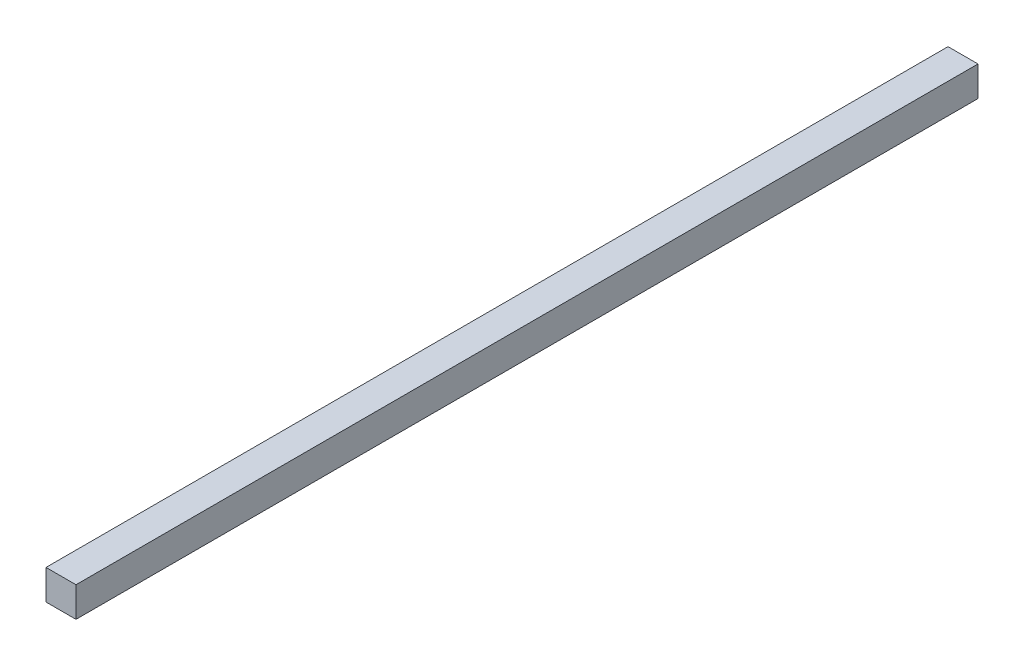
ISO-10303-21;
HEADER;
FILE_DESCRIPTION(('STEP AP214'),'2;1');
FILE_NAME('part.step','',(''),(''),'','','');
FILE_SCHEMA(('AUTOMOTIVE_DESIGN { 1 0 10303 214 1 1 1 1 }'));
ENDSEC;
DATA;
#1=APPLICATION_CONTEXT('core data for automotive mechanical design processes');
#2=APPLICATION_PROTOCOL_DEFINITION('international standard','automotive_design',2000,#1);
#3=PRODUCT_CONTEXT('',#1,'mechanical');
#4=PRODUCT('Part','Part','',(#3));
#5=PRODUCT_RELATED_PRODUCT_CATEGORY('part','',(#4));
#6=PRODUCT_DEFINITION_FORMATION('','',#4);
#7=PRODUCT_DEFINITION_CONTEXT('part definition',#1,'design');
#8=PRODUCT_DEFINITION('design','',#6,#7);
#9=PRODUCT_DEFINITION_SHAPE('','',#8);
#10=(LENGTH_UNIT() NAMED_UNIT(*) SI_UNIT(.MILLI.,.METRE.));
#11=(NAMED_UNIT(*) PLANE_ANGLE_UNIT() SI_UNIT($,.RADIAN.));
#12=(NAMED_UNIT(*) SI_UNIT($,.STERADIAN.) SOLID_ANGLE_UNIT());
#13=UNCERTAINTY_MEASURE_WITH_UNIT(LENGTH_MEASURE(1.E-05),#10,'distance_accuracy_value','');
#14=(GEOMETRIC_REPRESENTATION_CONTEXT(3) GLOBAL_UNCERTAINTY_ASSIGNED_CONTEXT((#13)) GLOBAL_UNIT_ASSIGNED_CONTEXT((#10,
#11,#12)) REPRESENTATION_CONTEXT('',''));
#15=CARTESIAN_POINT('',(0.,0.,0.));
#16=DIRECTION('',(0.,0.,1.));
#17=DIRECTION('',(1.,0.,0.));
#18=AXIS2_PLACEMENT_3D('',#15,#16,#17);
#19=CARTESIAN_POINT('',(0.,0.,300.81));
#20=DIRECTION('',(1.,0.,0.));
#21=DIRECTION('',(0.,0.,-1.));
#22=AXIS2_PLACEMENT_3D('',#19,#20,#21);
#23=PLANE('',#22);
#24=DIRECTION('',(0.,-1.,0.));
#25=VECTOR('',#24,1.);
#26=CARTESIAN_POINT('',(0.,0.,0.));
#27=LINE('',#26,#25);
#28=CARTESIAN_POINT('',(0.,10.,0.));
#29=VERTEX_POINT('',#28);
#30=CARTESIAN_POINT('',(0.,0.,0.));
#31=VERTEX_POINT('',#30);
#32=EDGE_CURVE('E96',#29,#31,#27,.T.);
#33=ORIENTED_EDGE('',*,*,#32,.T.);
#34=DIRECTION('',(0.,0.,-1.));
#35=VECTOR('',#34,1.);
#36=CARTESIAN_POINT('',(0.,0.,300.81));
#37=LINE('',#36,#35);
#38=CARTESIAN_POINT('',(0.,0.,300.81));
#39=VERTEX_POINT('',#38);
#40=EDGE_CURVE('E11',#39,#31,#37,.T.);
#41=ORIENTED_EDGE('',*,*,#40,.F.);
#42=DIRECTION('',(0.,-1.,0.));
#43=VECTOR('',#42,1.);
#44=CARTESIAN_POINT('',(0.,0.,300.81));
#45=LINE('',#44,#43);
#46=CARTESIAN_POINT('',(0.,10.,300.81));
#47=VERTEX_POINT('',#46);
#48=EDGE_CURVE('E84',#47,#39,#45,.T.);
#49=ORIENTED_EDGE('',*,*,#48,.F.);
#50=DIRECTION('',(0.,0.,-1.));
#51=VECTOR('',#50,1.);
#52=CARTESIAN_POINT('',(0.,10.,300.81));
#53=LINE('',#52,#51);
#54=EDGE_CURVE('E92',#47,#29,#53,.T.);
#55=ORIENTED_EDGE('',*,*,#54,.T.);
#56=EDGE_LOOP('',(#33,#41,#49,#55));
#57=FACE_BOUND('',#56,.T.);
#58=ADVANCED_FACE('F33',(#57),#23,.F.);
#59=CARTESIAN_POINT('',(0.,0.,300.81));
#60=DIRECTION('',(0.,1.,0.));
#61=DIRECTION('',(0.,0.,1.));
#62=AXIS2_PLACEMENT_3D('',#59,#60,#61);
#63=PLANE('',#62);
#64=DIRECTION('',(1.,0.,0.));
#65=VECTOR('',#64,1.);
#66=CARTESIAN_POINT('',(0.,0.,0.));
#67=LINE('',#66,#65);
#68=CARTESIAN_POINT('',(10.,0.,0.));
#69=VERTEX_POINT('',#68);
#70=EDGE_CURVE('E88',#31,#69,#67,.T.);
#71=ORIENTED_EDGE('',*,*,#70,.T.);
#72=DIRECTION('',(0.,0.,-1.));
#73=VECTOR('',#72,1.);
#74=CARTESIAN_POINT('',(10.,0.,300.81));
#75=LINE('',#74,#73);
#76=CARTESIAN_POINT('',(10.,0.,300.81));
#77=VERTEX_POINT('',#76);
#78=EDGE_CURVE('E41',#77,#69,#75,.T.);
#79=ORIENTED_EDGE('',*,*,#78,.F.);
#80=DIRECTION('',(1.,0.,0.));
#81=VECTOR('',#80,1.);
#82=CARTESIAN_POINT('',(0.,0.,300.81));
#83=LINE('',#82,#81);
#84=EDGE_CURVE('E79',#39,#77,#83,.T.);
#85=ORIENTED_EDGE('',*,*,#84,.F.);
#86=ORIENTED_EDGE('',*,*,#40,.T.);
#87=EDGE_LOOP('',(#71,#79,#85,#86));
#88=FACE_BOUND('',#87,.T.);
#89=ADVANCED_FACE('F87',(#88),#63,.F.);
#90=CARTESIAN_POINT('',(10.,0.,300.81));
#91=DIRECTION('',(-1.,0.,0.));
#92=DIRECTION('',(0.,0.,1.));
#93=AXIS2_PLACEMENT_3D('',#90,#91,#92);
#94=PLANE('',#93);
#95=DIRECTION('',(0.,1.,0.));
#96=VECTOR('',#95,1.);
#97=CARTESIAN_POINT('',(10.,0.,0.));
#98=LINE('',#97,#96);
#99=CARTESIAN_POINT('',(10.,10.,0.));
#100=VERTEX_POINT('',#99);
#101=EDGE_CURVE('E66',#69,#100,#98,.T.);
#102=ORIENTED_EDGE('',*,*,#101,.T.);
#103=DIRECTION('',(0.,0.,-1.));
#104=VECTOR('',#103,1.);
#105=CARTESIAN_POINT('',(10.,10.,300.81));
#106=LINE('',#105,#104);
#107=CARTESIAN_POINT('',(10.,10.,300.81));
#108=VERTEX_POINT('',#107);
#109=EDGE_CURVE('E89',#108,#100,#106,.T.);
#110=ORIENTED_EDGE('',*,*,#109,.F.);
#111=DIRECTION('',(0.,1.,0.));
#112=VECTOR('',#111,1.);
#113=CARTESIAN_POINT('',(10.,0.,300.81));
#114=LINE('',#113,#112);
#115=EDGE_CURVE('E82',#77,#108,#114,.T.);
#116=ORIENTED_EDGE('',*,*,#115,.F.);
#117=ORIENTED_EDGE('',*,*,#78,.T.);
#118=EDGE_LOOP('',(#102,#110,#116,#117));
#119=FACE_BOUND('',#118,.T.);
#120=ADVANCED_FACE('F90',(#119),#94,.F.);
#121=CARTESIAN_POINT('',(0.,10.,300.81));
#122=DIRECTION('',(0.,-1.,0.));
#123=DIRECTION('',(0.,0.,-1.));
#124=AXIS2_PLACEMENT_3D('',#121,#122,#123);
#125=PLANE('',#124);
#126=DIRECTION('',(-1.,0.,0.));
#127=VECTOR('',#126,1.);
#128=CARTESIAN_POINT('',(0.,10.,0.));
#129=LINE('',#128,#127);
#130=EDGE_CURVE('E72',#100,#29,#129,.T.);
#131=ORIENTED_EDGE('',*,*,#130,.T.);
#132=ORIENTED_EDGE('',*,*,#54,.F.);
#133=DIRECTION('',(-1.,0.,0.));
#134=VECTOR('',#133,1.);
#135=CARTESIAN_POINT('',(0.,10.,300.81));
#136=LINE('',#135,#134);
#137=EDGE_CURVE('E49',#108,#47,#136,.T.);
#138=ORIENTED_EDGE('',*,*,#137,.F.);
#139=ORIENTED_EDGE('',*,*,#109,.T.);
#140=EDGE_LOOP('',(#131,#132,#138,#139));
#141=FACE_BOUND('',#140,.T.);
#142=ADVANCED_FACE('F103',(#141),#125,.F.);
#143=CARTESIAN_POINT('',(0.,0.,300.81));
#144=DIRECTION('',(0.,0.,-1.));
#145=DIRECTION('',(-1.,0.,0.));
#146=AXIS2_PLACEMENT_3D('',#143,#144,#145);
#147=PLANE('',#146);
#148=ORIENTED_EDGE('',*,*,#48,.T.);
#149=ORIENTED_EDGE('',*,*,#84,.T.);
#150=ORIENTED_EDGE('',*,*,#115,.T.);
#151=ORIENTED_EDGE('',*,*,#137,.T.);
#152=EDGE_LOOP('',(#148,#149,#150,#151));
#153=FACE_BOUND('',#152,.T.);
#154=ADVANCED_FACE('F80',(#153),#147,.F.);
#155=CARTESIAN_POINT('',(0.,0.,0.));
#156=DIRECTION('',(0.,0.,-1.));
#157=DIRECTION('',(-1.,0.,0.));
#158=AXIS2_PLACEMENT_3D('',#155,#156,#157);
#159=PLANE('',#158);
#160=ORIENTED_EDGE('',*,*,#32,.F.);
#161=ORIENTED_EDGE('',*,*,#130,.F.);
#162=ORIENTED_EDGE('',*,*,#101,.F.);
#163=ORIENTED_EDGE('',*,*,#70,.F.);
#164=EDGE_LOOP('',(#160,#161,#162,#163));
#165=FACE_BOUND('',#164,.T.);
#166=ADVANCED_FACE('F106',(#165),#159,.T.);
#167=CLOSED_SHELL('',(#58,#89,#120,#142,#154,#166));
#168=MANIFOLD_SOLID_BREP('B2',#167);
#169=ADVANCED_BREP_SHAPE_REPRESENTATION('',(#18,#168),#14);
#170=SHAPE_DEFINITION_REPRESENTATION(#9,#169);
ENDSEC;
END-ISO-10303-21;
